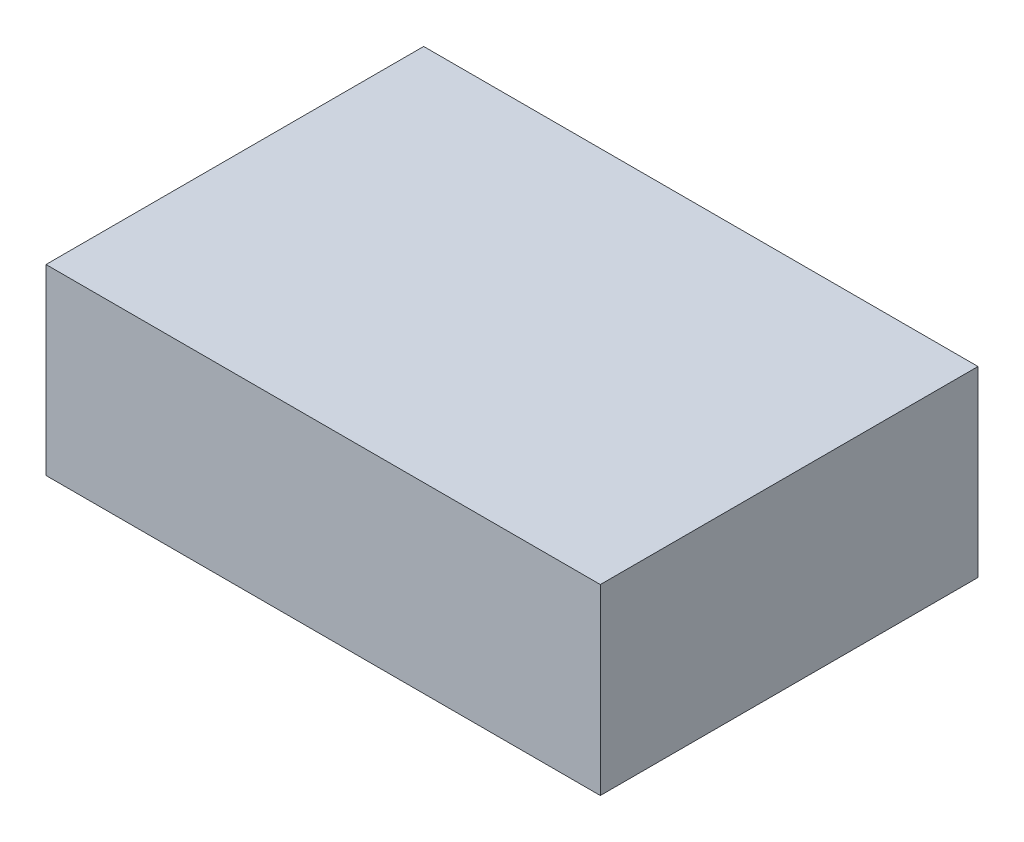
ISO-10303-21;
HEADER;
FILE_DESCRIPTION(('STEP AP214'),'2;1');
FILE_NAME('part.step','',(''),(''),'','','');
FILE_SCHEMA(('AUTOMOTIVE_DESIGN { 1 0 10303 214 1 1 1 1 }'));
ENDSEC;
DATA;
#1=APPLICATION_CONTEXT('core data for automotive mechanical design processes');
#2=APPLICATION_PROTOCOL_DEFINITION('international standard','automotive_design',2000,#1);
#3=PRODUCT_CONTEXT('',#1,'mechanical');
#4=PRODUCT('Part','Part','',(#3));
#5=PRODUCT_RELATED_PRODUCT_CATEGORY('part','',(#4));
#6=PRODUCT_DEFINITION_FORMATION('','',#4);
#7=PRODUCT_DEFINITION_CONTEXT('part definition',#1,'design');
#8=PRODUCT_DEFINITION('design','',#6,#7);
#9=PRODUCT_DEFINITION_SHAPE('','',#8);
#10=(LENGTH_UNIT() NAMED_UNIT(*) SI_UNIT(.MILLI.,.METRE.));
#11=(NAMED_UNIT(*) PLANE_ANGLE_UNIT() SI_UNIT($,.RADIAN.));
#12=(NAMED_UNIT(*) SI_UNIT($,.STERADIAN.) SOLID_ANGLE_UNIT());
#13=UNCERTAINTY_MEASURE_WITH_UNIT(LENGTH_MEASURE(1.E-05),#10,'distance_accuracy_value','');
#14=(GEOMETRIC_REPRESENTATION_CONTEXT(3) GLOBAL_UNCERTAINTY_ASSIGNED_CONTEXT((#13)) GLOBAL_UNIT_ASSIGNED_CONTEXT((#10,
#11,#12)) REPRESENTATION_CONTEXT('',''));
#15=CARTESIAN_POINT('',(0.,0.,0.));
#16=DIRECTION('',(0.,0.,1.));
#17=DIRECTION('',(1.,0.,0.));
#18=AXIS2_PLACEMENT_3D('',#15,#16,#17);
#19=CARTESIAN_POINT('',(0.,30.,0.));
#20=DIRECTION('',(1.,0.,0.));
#21=DIRECTION('',(0.,0.,-1.));
#22=AXIS2_PLACEMENT_3D('',#19,#20,#21);
#23=PLANE('',#22);
#24=DIRECTION('',(0.,0.,1.));
#25=VECTOR('',#24,1.);
#26=CARTESIAN_POINT('',(0.,0.,0.));
#27=LINE('',#26,#25);
#28=CARTESIAN_POINT('',(0.,0.,-62.));
#29=VERTEX_POINT('',#28);
#30=CARTESIAN_POINT('',(0.,0.,0.));
#31=VERTEX_POINT('',#30);
#32=EDGE_CURVE('E103',#29,#31,#27,.T.);
#33=ORIENTED_EDGE('',*,*,#32,.T.);
#34=DIRECTION('',(0.,-1.,0.));
#35=VECTOR('',#34,1.);
#36=CARTESIAN_POINT('',(0.,30.,0.));
#37=LINE('',#36,#35);
#38=CARTESIAN_POINT('',(0.,30.,0.));
#39=VERTEX_POINT('',#38);
#40=EDGE_CURVE('E11',#39,#31,#37,.T.);
#41=ORIENTED_EDGE('',*,*,#40,.F.);
#42=DIRECTION('',(0.,0.,1.));
#43=VECTOR('',#42,1.);
#44=CARTESIAN_POINT('',(0.,30.,0.));
#45=LINE('',#44,#43);
#46=CARTESIAN_POINT('',(0.,30.,-62.));
#47=VERTEX_POINT('',#46);
#48=EDGE_CURVE('E91',#47,#39,#45,.T.);
#49=ORIENTED_EDGE('',*,*,#48,.F.);
#50=DIRECTION('',(0.,-1.,0.));
#51=VECTOR('',#50,1.);
#52=CARTESIAN_POINT('',(0.,30.,-62.));
#53=LINE('',#52,#51);
#54=EDGE_CURVE('E99',#47,#29,#53,.T.);
#55=ORIENTED_EDGE('',*,*,#54,.T.);
#56=EDGE_LOOP('',(#33,#41,#49,#55));
#57=FACE_BOUND('',#56,.T.);
#58=ADVANCED_FACE('F40',(#57),#23,.F.);
#59=CARTESIAN_POINT('',(0.,30.,0.));
#60=DIRECTION('',(0.,0.,-1.));
#61=DIRECTION('',(-1.,0.,0.));
#62=AXIS2_PLACEMENT_3D('',#59,#60,#61);
#63=PLANE('',#62);
#64=DIRECTION('',(1.,0.,0.));
#65=VECTOR('',#64,1.);
#66=CARTESIAN_POINT('',(0.,0.,0.));
#67=LINE('',#66,#65);
#68=CARTESIAN_POINT('',(91.,0.,0.));
#69=VERTEX_POINT('',#68);
#70=EDGE_CURVE('E95',#31,#69,#67,.T.);
#71=ORIENTED_EDGE('',*,*,#70,.T.);
#72=DIRECTION('',(0.,-1.,0.));
#73=VECTOR('',#72,1.);
#74=CARTESIAN_POINT('',(91.,30.,0.));
#75=LINE('',#74,#73);
#76=CARTESIAN_POINT('',(91.,30.,0.));
#77=VERTEX_POINT('',#76);
#78=EDGE_CURVE('E48',#77,#69,#75,.T.);
#79=ORIENTED_EDGE('',*,*,#78,.F.);
#80=DIRECTION('',(1.,0.,0.));
#81=VECTOR('',#80,1.);
#82=CARTESIAN_POINT('',(0.,30.,0.));
#83=LINE('',#82,#81);
#84=EDGE_CURVE('E86',#39,#77,#83,.T.);
#85=ORIENTED_EDGE('',*,*,#84,.F.);
#86=ORIENTED_EDGE('',*,*,#40,.T.);
#87=EDGE_LOOP('',(#71,#79,#85,#86));
#88=FACE_BOUND('',#87,.T.);
#89=ADVANCED_FACE('F94',(#88),#63,.F.);
#90=CARTESIAN_POINT('',(91.,30.,0.));
#91=DIRECTION('',(-1.,0.,0.));
#92=DIRECTION('',(0.,0.,1.));
#93=AXIS2_PLACEMENT_3D('',#90,#91,#92);
#94=PLANE('',#93);
#95=DIRECTION('',(0.,0.,-1.));
#96=VECTOR('',#95,1.);
#97=CARTESIAN_POINT('',(91.,0.,0.));
#98=LINE('',#97,#96);
#99=CARTESIAN_POINT('',(91.,0.,-62.));
#100=VERTEX_POINT('',#99);
#101=EDGE_CURVE('E73',#69,#100,#98,.T.);
#102=ORIENTED_EDGE('',*,*,#101,.T.);
#103=DIRECTION('',(0.,-1.,0.));
#104=VECTOR('',#103,1.);
#105=CARTESIAN_POINT('',(91.,30.,-62.));
#106=LINE('',#105,#104);
#107=CARTESIAN_POINT('',(91.,30.,-62.));
#108=VERTEX_POINT('',#107);
#109=EDGE_CURVE('E96',#108,#100,#106,.T.);
#110=ORIENTED_EDGE('',*,*,#109,.F.);
#111=DIRECTION('',(0.,0.,-1.));
#112=VECTOR('',#111,1.);
#113=CARTESIAN_POINT('',(91.,30.,0.));
#114=LINE('',#113,#112);
#115=EDGE_CURVE('E89',#77,#108,#114,.T.);
#116=ORIENTED_EDGE('',*,*,#115,.F.);
#117=ORIENTED_EDGE('',*,*,#78,.T.);
#118=EDGE_LOOP('',(#102,#110,#116,#117));
#119=FACE_BOUND('',#118,.T.);
#120=ADVANCED_FACE('F97',(#119),#94,.F.);
#121=CARTESIAN_POINT('',(0.,30.,-62.));
#122=DIRECTION('',(0.,0.,1.));
#123=DIRECTION('',(1.,0.,0.));
#124=AXIS2_PLACEMENT_3D('',#121,#122,#123);
#125=PLANE('',#124);
#126=DIRECTION('',(-1.,0.,0.));
#127=VECTOR('',#126,1.);
#128=CARTESIAN_POINT('',(0.,0.,-62.));
#129=LINE('',#128,#127);
#130=EDGE_CURVE('E79',#100,#29,#129,.T.);
#131=ORIENTED_EDGE('',*,*,#130,.T.);
#132=ORIENTED_EDGE('',*,*,#54,.F.);
#133=DIRECTION('',(-1.,0.,0.));
#134=VECTOR('',#133,1.);
#135=CARTESIAN_POINT('',(0.,30.,-62.));
#136=LINE('',#135,#134);
#137=EDGE_CURVE('E56',#108,#47,#136,.T.);
#138=ORIENTED_EDGE('',*,*,#137,.F.);
#139=ORIENTED_EDGE('',*,*,#109,.T.);
#140=EDGE_LOOP('',(#131,#132,#138,#139));
#141=FACE_BOUND('',#140,.T.);
#142=ADVANCED_FACE('F110',(#141),#125,.F.);
#143=CARTESIAN_POINT('',(0.,30.,0.));
#144=DIRECTION('',(0.,-1.,0.));
#145=DIRECTION('',(0.,0.,-1.));
#146=AXIS2_PLACEMENT_3D('',#143,#144,#145);
#147=PLANE('',#146);
#148=ORIENTED_EDGE('',*,*,#48,.T.);
#149=ORIENTED_EDGE('',*,*,#84,.T.);
#150=ORIENTED_EDGE('',*,*,#115,.T.);
#151=ORIENTED_EDGE('',*,*,#137,.T.);
#152=EDGE_LOOP('',(#148,#149,#150,#151));
#153=FACE_BOUND('',#152,.T.);
#154=ADVANCED_FACE('F87',(#153),#147,.F.);
#155=CARTESIAN_POINT('',(0.,0.,0.));
#156=DIRECTION('',(0.,-1.,0.));
#157=DIRECTION('',(0.,0.,-1.));
#158=AXIS2_PLACEMENT_3D('',#155,#156,#157);
#159=PLANE('',#158);
#160=ORIENTED_EDGE('',*,*,#32,.F.);
#161=ORIENTED_EDGE('',*,*,#130,.F.);
#162=ORIENTED_EDGE('',*,*,#101,.F.);
#163=ORIENTED_EDGE('',*,*,#70,.F.);
#164=EDGE_LOOP('',(#160,#161,#162,#163));
#165=FACE_BOUND('',#164,.T.);
#166=ADVANCED_FACE('F113',(#165),#159,.T.);
#167=CLOSED_SHELL('',(#58,#89,#120,#142,#154,#166));
#168=MANIFOLD_SOLID_BREP('B2',#167);
#169=ADVANCED_BREP_SHAPE_REPRESENTATION('',(#18,#168),#14);
#170=SHAPE_DEFINITION_REPRESENTATION(#9,#169);
ENDSEC;
END-ISO-10303-21;
